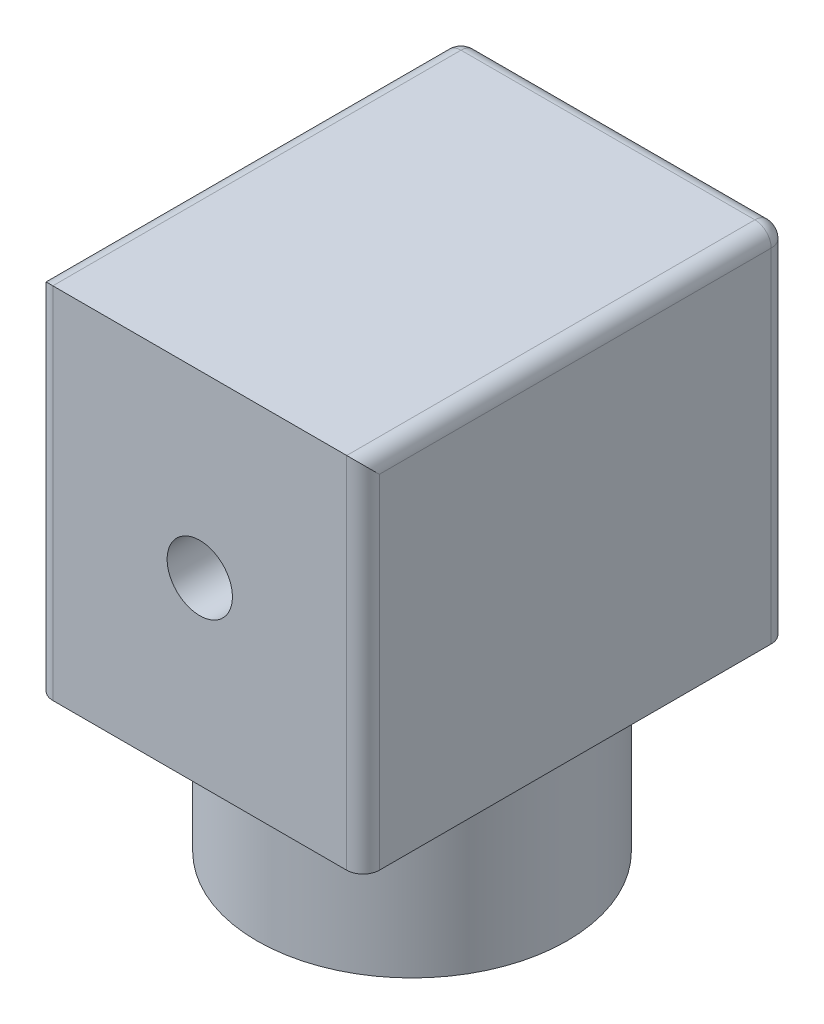
ISO-10303-21;
HEADER;
FILE_DESCRIPTION(('STEP AP214'),'2;1');
FILE_NAME('part.step','',(''),(''),'','','');
FILE_SCHEMA(('AUTOMOTIVE_DESIGN { 1 0 10303 214 1 1 1 1 }'));
ENDSEC;
DATA;
#1=APPLICATION_CONTEXT('core data for automotive mechanical design processes');
#2=APPLICATION_PROTOCOL_DEFINITION('international standard','automotive_design',2000,#1);
#3=PRODUCT_CONTEXT('',#1,'mechanical');
#4=PRODUCT('Part','Part','',(#3));
#5=PRODUCT_RELATED_PRODUCT_CATEGORY('part','',(#4));
#6=PRODUCT_DEFINITION_FORMATION('','',#4);
#7=PRODUCT_DEFINITION_CONTEXT('part definition',#1,'design');
#8=PRODUCT_DEFINITION('design','',#6,#7);
#9=PRODUCT_DEFINITION_SHAPE('','',#8);
#10=(LENGTH_UNIT() NAMED_UNIT(*) SI_UNIT(.MILLI.,.METRE.));
#11=(NAMED_UNIT(*) PLANE_ANGLE_UNIT() SI_UNIT($,.RADIAN.));
#12=(NAMED_UNIT(*) SI_UNIT($,.STERADIAN.) SOLID_ANGLE_UNIT());
#13=UNCERTAINTY_MEASURE_WITH_UNIT(LENGTH_MEASURE(1.E-05),#10,'distance_accuracy_value','');
#14=(GEOMETRIC_REPRESENTATION_CONTEXT(3) GLOBAL_UNCERTAINTY_ASSIGNED_CONTEXT((#13)) GLOBAL_UNIT_ASSIGNED_CONTEXT((#10,
#11,#12)) REPRESENTATION_CONTEXT('',''));
#15=CARTESIAN_POINT('',(0.,0.,0.));
#16=DIRECTION('',(0.,0.,1.));
#17=DIRECTION('',(1.,0.,0.));
#18=AXIS2_PLACEMENT_3D('',#15,#16,#17);
#19=CARTESIAN_POINT('',(-50.,55.,130.));
#20=DIRECTION('',(1.,0.,0.));
#21=DIRECTION('',(0.,1.,0.));
#22=AXIS2_PLACEMENT_3D('',#19,#20,#21);
#23=PLANE('',#22);
#24=DIRECTION('',(0.,0.,-1.));
#25=VECTOR('',#24,1.);
#26=CARTESIAN_POINT('',(-50.,-55.,130.));
#27=LINE('',#26,#25);
#28=CARTESIAN_POINT('',(-50.,-55.,125.));
#29=VERTEX_POINT('',#28);
#30=CARTESIAN_POINT('',(-50.,-55.,5.));
#31=VERTEX_POINT('',#30);
#32=EDGE_CURVE('E118',#29,#31,#27,.T.);
#33=ORIENTED_EDGE('',*,*,#32,.F.);
#34=DIRECTION('',(0.,-1.,0.));
#35=VECTOR('',#34,1.);
#36=CARTESIAN_POINT('',(-50.,55.,125.));
#37=LINE('',#36,#35);
#38=CARTESIAN_POINT('',(-50.,50.,125.));
#39=VERTEX_POINT('',#38);
#40=EDGE_CURVE('E131',#29,#39,#37,.F.);
#41=ORIENTED_EDGE('',*,*,#40,.T.);
#42=DIRECTION('',(0.,0.,-1.));
#43=VECTOR('',#42,1.);
#44=CARTESIAN_POINT('',(-50.,50.,130.));
#45=LINE('',#44,#43);
#46=CARTESIAN_POINT('',(-50.,50.,5.));
#47=VERTEX_POINT('',#46);
#48=EDGE_CURVE('E134',#39,#47,#45,.T.);
#49=ORIENTED_EDGE('',*,*,#48,.T.);
#50=DIRECTION('',(0.,-1.,0.));
#51=VECTOR('',#50,1.);
#52=CARTESIAN_POINT('',(-50.,-55.,5.));
#53=LINE('',#52,#51);
#54=EDGE_CURVE('E141',#47,#31,#53,.T.);
#55=ORIENTED_EDGE('',*,*,#54,.T.);
#56=EDGE_LOOP('',(#33,#41,#49,#55));
#57=FACE_BOUND('',#56,.T.);
#58=ADVANCED_FACE('F36',(#57),#23,.F.);
#59=CARTESIAN_POINT('',(50.,-55.,130.));
#60=DIRECTION('',(0.,1.,0.));
#61=DIRECTION('',(-1.,0.,0.));
#62=AXIS2_PLACEMENT_3D('',#59,#60,#61);
#63=PLANE('',#62);
#64=CARTESIAN_POINT('',(0.,-55.,65.));
#65=DIRECTION('',(0.,1.,0.));
#66=DIRECTION('',(-1.,0.,0.));
#67=AXIS2_PLACEMENT_3D('',#64,#65,#66);
#68=CIRCLE('',#67,47.5);
#69=CARTESIAN_POINT('',(-47.5,-55.,65.));
#70=VERTEX_POINT('',#69);
#71=EDGE_CURVE('E189',#70,#70,#68,.T.);
#72=ORIENTED_EDGE('',*,*,#71,.T.);
#73=EDGE_LOOP('',(#72));
#74=FACE_BOUND('',#73,.T.);
#75=DIRECTION('',(0.,0.,-1.));
#76=VECTOR('',#75,1.);
#77=CARTESIAN_POINT('',(50.,-55.,130.));
#78=LINE('',#77,#76);
#79=CARTESIAN_POINT('',(50.,-55.,125.));
#80=VERTEX_POINT('',#79);
#81=CARTESIAN_POINT('',(50.,-55.,5.));
#82=VERTEX_POINT('',#81);
#83=EDGE_CURVE('E198',#80,#82,#78,.T.);
#84=ORIENTED_EDGE('',*,*,#83,.F.);
#85=CARTESIAN_POINT('',(45.,-55.,125.));
#86=DIRECTION('',(0.,1.,0.));
#87=DIRECTION('',(-1.,0.,0.));
#88=AXIS2_PLACEMENT_3D('',#85,#86,#87);
#89=CIRCLE('',#88,5.);
#90=CARTESIAN_POINT('',(45.,-55.,130.));
#91=VERTEX_POINT('',#90);
#92=EDGE_CURVE('E127',#80,#91,#89,.F.);
#93=ORIENTED_EDGE('',*,*,#92,.T.);
#94=DIRECTION('',(1.,0.,0.));
#95=VECTOR('',#94,1.);
#96=CARTESIAN_POINT('',(50.,-55.,130.));
#97=LINE('',#96,#95);
#98=CARTESIAN_POINT('',(-45.,-55.,130.));
#99=VERTEX_POINT('',#98);
#100=EDGE_CURVE('E110',#99,#91,#97,.T.);
#101=ORIENTED_EDGE('',*,*,#100,.F.);
#102=CARTESIAN_POINT('',(-45.,-55.,125.));
#103=DIRECTION('',(0.,1.,0.));
#104=DIRECTION('',(-1.,0.,0.));
#105=AXIS2_PLACEMENT_3D('',#102,#103,#104);
#106=CIRCLE('',#105,5.);
#107=EDGE_CURVE('E124',#99,#29,#106,.F.);
#108=ORIENTED_EDGE('',*,*,#107,.T.);
#109=ORIENTED_EDGE('',*,*,#32,.T.);
#110=CARTESIAN_POINT('',(-45.,-55.,5.));
#111=DIRECTION('',(0.,1.,0.));
#112=DIRECTION('',(-1.,0.,0.));
#113=AXIS2_PLACEMENT_3D('',#110,#111,#112);
#114=CIRCLE('',#113,5.);
#115=CARTESIAN_POINT('',(-45.,-55.,0.));
#116=VERTEX_POINT('',#115);
#117=EDGE_CURVE('E136',#31,#116,#114,.F.);
#118=ORIENTED_EDGE('',*,*,#117,.T.);
#119=DIRECTION('',(1.,0.,0.));
#120=VECTOR('',#119,1.);
#121=CARTESIAN_POINT('',(50.,-55.,0.));
#122=LINE('',#121,#120);
#123=CARTESIAN_POINT('',(45.,-55.,0.));
#124=VERTEX_POINT('',#123);
#125=EDGE_CURVE('E128',#116,#124,#122,.T.);
#126=ORIENTED_EDGE('',*,*,#125,.T.);
#127=CARTESIAN_POINT('',(45.,-55.,5.));
#128=DIRECTION('',(0.,1.,0.));
#129=DIRECTION('',(-1.,0.,0.));
#130=AXIS2_PLACEMENT_3D('',#127,#128,#129);
#131=CIRCLE('',#130,5.);
#132=EDGE_CURVE('E132',#124,#82,#131,.F.);
#133=ORIENTED_EDGE('',*,*,#132,.T.);
#134=EDGE_LOOP('',(#84,#93,#101,#108,#109,#118,#126,#133));
#135=FACE_BOUND('',#134,.T.);
#136=ADVANCED_FACE('F122',(#74,#135),#63,.F.);
#137=CARTESIAN_POINT('',(50.,55.,130.));
#138=DIRECTION('',(-1.,0.,0.));
#139=DIRECTION('',(0.,-1.,0.));
#140=AXIS2_PLACEMENT_3D('',#137,#138,#139);
#141=PLANE('',#140);
#142=DIRECTION('',(0.,0.,-1.));
#143=VECTOR('',#142,1.);
#144=CARTESIAN_POINT('',(50.,50.,130.));
#145=LINE('',#144,#143);
#146=CARTESIAN_POINT('',(50.,50.,5.));
#147=VERTEX_POINT('',#146);
#148=CARTESIAN_POINT('',(50.,50.,125.));
#149=VERTEX_POINT('',#148);
#150=EDGE_CURVE('E205',#147,#149,#145,.F.);
#151=ORIENTED_EDGE('',*,*,#150,.T.);
#152=DIRECTION('',(0.,1.,0.));
#153=VECTOR('',#152,1.);
#154=CARTESIAN_POINT('',(50.,55.,125.));
#155=LINE('',#154,#153);
#156=EDGE_CURVE('E209',#149,#80,#155,.F.);
#157=ORIENTED_EDGE('',*,*,#156,.T.);
#158=ORIENTED_EDGE('',*,*,#83,.T.);
#159=DIRECTION('',(0.,1.,0.));
#160=VECTOR('',#159,1.);
#161=CARTESIAN_POINT('',(50.,55.,5.));
#162=LINE('',#161,#160);
#163=EDGE_CURVE('E207',#82,#147,#162,.T.);
#164=ORIENTED_EDGE('',*,*,#163,.T.);
#165=EDGE_LOOP('',(#151,#157,#158,#164));
#166=FACE_BOUND('',#165,.T.);
#167=ADVANCED_FACE('F232',(#166),#141,.F.);
#168=CARTESIAN_POINT('',(50.,55.,130.));
#169=DIRECTION('',(0.,-1.,0.));
#170=DIRECTION('',(1.,0.,0.));
#171=AXIS2_PLACEMENT_3D('',#168,#169,#170);
#172=PLANE('',#171);
#173=DIRECTION('',(-1.,0.,0.));
#174=VECTOR('',#173,1.);
#175=CARTESIAN_POINT('',(50.,55.,130.));
#176=LINE('',#175,#174);
#177=CARTESIAN_POINT('',(45.,55.,130.));
#178=VERTEX_POINT('',#177);
#179=CARTESIAN_POINT('',(-45.,55.,130.));
#180=VERTEX_POINT('',#179);
#181=EDGE_CURVE('E112',#178,#180,#176,.T.);
#182=ORIENTED_EDGE('',*,*,#181,.F.);
#183=DIRECTION('',(0.,0.,-1.));
#184=VECTOR('',#183,1.);
#185=CARTESIAN_POINT('',(45.,55.,130.));
#186=LINE('',#185,#184);
#187=CARTESIAN_POINT('',(45.,55.,5.));
#188=VERTEX_POINT('',#187);
#189=EDGE_CURVE('E11',#178,#188,#186,.T.);
#190=ORIENTED_EDGE('',*,*,#189,.T.);
#191=DIRECTION('',(-1.,0.,0.));
#192=VECTOR('',#191,1.);
#193=CARTESIAN_POINT('',(-50.,55.,5.));
#194=LINE('',#193,#192);
#195=CARTESIAN_POINT('',(-45.,55.,5.));
#196=VERTEX_POINT('',#195);
#197=EDGE_CURVE('E45',#188,#196,#194,.T.);
#198=ORIENTED_EDGE('',*,*,#197,.T.);
#199=DIRECTION('',(0.,0.,-1.));
#200=VECTOR('',#199,1.);
#201=CARTESIAN_POINT('',(-45.,55.,130.));
#202=LINE('',#201,#200);
#203=EDGE_CURVE('E150',#196,#180,#202,.F.);
#204=ORIENTED_EDGE('',*,*,#203,.T.);
#205=EDGE_LOOP('',(#182,#190,#198,#204));
#206=FACE_BOUND('',#205,.T.);
#207=ADVANCED_FACE('F240',(#206),#172,.F.);
#208=CARTESIAN_POINT('',(0.,0.,130.));
#209=DIRECTION('',(0.,0.,-1.));
#210=DIRECTION('',(-1.,0.,0.));
#211=AXIS2_PLACEMENT_3D('',#208,#209,#210);
#212=PLANE('',#211);
#213=CARTESIAN_POINT('',(0.,0.,130.));
#214=DIRECTION('',(0.,0.,1.));
#215=DIRECTION('',(1.,0.,0.));
#216=AXIS2_PLACEMENT_3D('',#213,#214,#215);
#217=CIRCLE('',#216,10.);
#218=CARTESIAN_POINT('',(10.,0.,130.));
#219=VERTEX_POINT('',#218);
#220=EDGE_CURVE('E174',#219,#219,#217,.T.);
#221=ORIENTED_EDGE('',*,*,#220,.F.);
#222=EDGE_LOOP('',(#221));
#223=FACE_BOUND('',#222,.T.);
#224=ORIENTED_EDGE('',*,*,#100,.T.);
#225=DIRECTION('',(0.,1.,0.));
#226=VECTOR('',#225,1.);
#227=CARTESIAN_POINT('',(45.,0.,130.));
#228=LINE('',#227,#226);
#229=EDGE_CURVE('E117',#91,#178,#228,.T.);
#230=ORIENTED_EDGE('',*,*,#229,.T.);
#231=ORIENTED_EDGE('',*,*,#181,.T.);
#232=DIRECTION('',(0.,-1.,0.));
#233=VECTOR('',#232,1.);
#234=CARTESIAN_POINT('',(-45.,0.,130.));
#235=LINE('',#234,#233);
#236=EDGE_CURVE('E106',#180,#99,#235,.T.);
#237=ORIENTED_EDGE('',*,*,#236,.T.);
#238=EDGE_LOOP('',(#224,#230,#231,#237));
#239=FACE_BOUND('',#238,.T.);
#240=ADVANCED_FACE('F108',(#223,#239),#212,.F.);
#241=CARTESIAN_POINT('',(0.,0.,0.));
#242=DIRECTION('',(0.,0.,-1.));
#243=DIRECTION('',(-1.,0.,0.));
#244=AXIS2_PLACEMENT_3D('',#241,#242,#243);
#245=PLANE('',#244);
#246=DIRECTION('',(-1.,0.,0.));
#247=VECTOR('',#246,1.);
#248=CARTESIAN_POINT('',(50.,50.,0.));
#249=LINE('',#248,#247);
#250=CARTESIAN_POINT('',(-45.,50.,0.));
#251=VERTEX_POINT('',#250);
#252=CARTESIAN_POINT('',(45.,50.,0.));
#253=VERTEX_POINT('',#252);
#254=EDGE_CURVE('E144',#251,#253,#249,.F.);
#255=ORIENTED_EDGE('',*,*,#254,.T.);
#256=DIRECTION('',(0.,1.,0.));
#257=VECTOR('',#256,1.);
#258=CARTESIAN_POINT('',(45.,-55.,0.));
#259=LINE('',#258,#257);
#260=EDGE_CURVE('E148',#253,#124,#259,.F.);
#261=ORIENTED_EDGE('',*,*,#260,.T.);
#262=ORIENTED_EDGE('',*,*,#125,.F.);
#263=DIRECTION('',(0.,-1.,0.));
#264=VECTOR('',#263,1.);
#265=CARTESIAN_POINT('',(-45.,55.,0.));
#266=LINE('',#265,#264);
#267=EDGE_CURVE('E146',#116,#251,#266,.F.);
#268=ORIENTED_EDGE('',*,*,#267,.T.);
#269=EDGE_LOOP('',(#255,#261,#262,#268));
#270=FACE_BOUND('',#269,.T.);
#271=ADVANCED_FACE('F217',(#270),#245,.T.);
#272=CARTESIAN_POINT('',(0.,-105.,65.));
#273=DIRECTION('',(0.,1.,0.));
#274=DIRECTION('',(-1.,0.,0.));
#275=AXIS2_PLACEMENT_3D('',#272,#273,#274);
#276=CYLINDRICAL_SURFACE('',#275,47.5);
#277=CARTESIAN_POINT('',(0.,-105.,65.));
#278=DIRECTION('',(0.,1.,0.));
#279=DIRECTION('',(-1.,0.,0.));
#280=AXIS2_PLACEMENT_3D('',#277,#278,#279);
#281=CIRCLE('',#280,47.5);
#282=CARTESIAN_POINT('',(-47.5,-105.,65.));
#283=VERTEX_POINT('',#282);
#284=EDGE_CURVE('E192',#283,#283,#281,.T.);
#285=ORIENTED_EDGE('',*,*,#284,.T.);
#286=EDGE_LOOP('',(#285));
#287=FACE_BOUND('',#286,.T.);
#288=ORIENTED_EDGE('',*,*,#71,.F.);
#289=EDGE_LOOP('',(#288));
#290=FACE_BOUND('',#289,.T.);
#291=ADVANCED_FACE('F295',(#287,#290),#276,.T.);
#292=CARTESIAN_POINT('',(0.,-105.,65.));
#293=DIRECTION('',(0.,1.,0.));
#294=DIRECTION('',(-1.,0.,0.));
#295=AXIS2_PLACEMENT_3D('',#292,#293,#294);
#296=PLANE('',#295);
#297=CARTESIAN_POINT('',(0.,-105.,65.));
#298=DIRECTION('',(0.,-1.,0.));
#299=DIRECTION('',(0.,0.,-1.));
#300=AXIS2_PLACEMENT_3D('',#297,#298,#299);
#301=CIRCLE('',#300,10.);
#302=CARTESIAN_POINT('',(0.,-105.,55.));
#303=VERTEX_POINT('',#302);
#304=EDGE_CURVE('E183',#303,#303,#301,.T.);
#305=ORIENTED_EDGE('',*,*,#304,.F.);
#306=EDGE_LOOP('',(#305));
#307=FACE_BOUND('',#306,.T.);
#308=ORIENTED_EDGE('',*,*,#284,.F.);
#309=EDGE_LOOP('',(#308));
#310=FACE_BOUND('',#309,.T.);
#311=ADVANCED_FACE('F291',(#307,#310),#296,.F.);
#312=CARTESIAN_POINT('',(0.,-85.,65.));
#313=DIRECTION('',(0.,-1.,0.));
#314=DIRECTION('',(0.,0.,-1.));
#315=AXIS2_PLACEMENT_3D('',#312,#313,#314);
#316=CYLINDRICAL_SURFACE('',#315,10.);
#317=CARTESIAN_POINT('',(0.,-85.,65.));
#318=DIRECTION('',(0.,-1.,0.));
#319=DIRECTION('',(0.,0.,-1.));
#320=AXIS2_PLACEMENT_3D('',#317,#318,#319);
#321=CIRCLE('',#320,10.);
#322=CARTESIAN_POINT('',(0.,-85.,55.));
#323=VERTEX_POINT('',#322);
#324=EDGE_CURVE('E186',#323,#323,#321,.T.);
#325=ORIENTED_EDGE('',*,*,#324,.F.);
#326=EDGE_LOOP('',(#325));
#327=FACE_BOUND('',#326,.T.);
#328=ORIENTED_EDGE('',*,*,#304,.T.);
#329=EDGE_LOOP('',(#328));
#330=FACE_BOUND('',#329,.T.);
#331=ADVANCED_FACE('F287',(#327,#330),#316,.F.);
#332=CARTESIAN_POINT('',(0.,-85.,65.));
#333=DIRECTION('',(0.,-1.,0.));
#334=DIRECTION('',(0.,0.,-1.));
#335=AXIS2_PLACEMENT_3D('',#332,#333,#334);
#336=PLANE('',#335);
#337=ORIENTED_EDGE('',*,*,#324,.T.);
#338=EDGE_LOOP('',(#337));
#339=FACE_BOUND('',#338,.T.);
#340=ADVANCED_FACE('F281',(#339),#336,.T.);
#341=CARTESIAN_POINT('',(0.,0.,110.));
#342=DIRECTION('',(0.,0.,1.));
#343=DIRECTION('',(1.,0.,0.));
#344=AXIS2_PLACEMENT_3D('',#341,#342,#343);
#345=CYLINDRICAL_SURFACE('',#344,10.);
#346=CARTESIAN_POINT('',(0.,0.,110.));
#347=DIRECTION('',(0.,0.,1.));
#348=DIRECTION('',(1.,0.,0.));
#349=AXIS2_PLACEMENT_3D('',#346,#347,#348);
#350=CIRCLE('',#349,10.);
#351=CARTESIAN_POINT('',(10.,0.,110.));
#352=VERTEX_POINT('',#351);
#353=EDGE_CURVE('E178',#352,#352,#350,.T.);
#354=ORIENTED_EDGE('',*,*,#353,.F.);
#355=EDGE_LOOP('',(#354));
#356=FACE_BOUND('',#355,.T.);
#357=ORIENTED_EDGE('',*,*,#220,.T.);
#358=EDGE_LOOP('',(#357));
#359=FACE_BOUND('',#358,.T.);
#360=ADVANCED_FACE('F275',(#356,#359),#345,.F.);
#361=CARTESIAN_POINT('',(0.,0.,110.));
#362=DIRECTION('',(0.,0.,1.));
#363=DIRECTION('',(1.,0.,0.));
#364=AXIS2_PLACEMENT_3D('',#361,#362,#363);
#365=PLANE('',#364);
#366=ORIENTED_EDGE('',*,*,#353,.T.);
#367=EDGE_LOOP('',(#366));
#368=FACE_BOUND('',#367,.T.);
#369=ADVANCED_FACE('F271',(#368),#365,.T.);
#370=CARTESIAN_POINT('',(-45.,0.,125.));
#371=DIRECTION('',(0.,-1.,0.));
#372=DIRECTION('',(1.,0.,0.));
#373=AXIS2_PLACEMENT_3D('',#370,#371,#372);
#374=CYLINDRICAL_SURFACE('',#373,5.);
#375=ORIENTED_EDGE('',*,*,#107,.F.);
#376=ORIENTED_EDGE('',*,*,#236,.F.);
#377=CARTESIAN_POINT('',(-45.,50.,125.));
#378=DIRECTION('',(0.,0.707106781186547,-0.707106781186547));
#379=DIRECTION('',(0.,-0.707106781186547,-0.707106781186547));
#380=AXIS2_PLACEMENT_3D('',#377,#378,#379);
#381=ELLIPSE('',#380,7.07106781186547,5.);
#382=EDGE_CURVE('E40',#39,#180,#381,.T.);
#383=ORIENTED_EDGE('',*,*,#382,.F.);
#384=ORIENTED_EDGE('',*,*,#40,.F.);
#385=EDGE_LOOP('',(#375,#376,#383,#384));
#386=FACE_BOUND('',#385,.T.);
#387=ADVANCED_FACE('F38',(#386),#374,.T.);
#388=CARTESIAN_POINT('',(-45.,50.,130.));
#389=DIRECTION('',(0.,0.,-1.));
#390=DIRECTION('',(-1.,0.,0.));
#391=AXIS2_PLACEMENT_3D('',#388,#389,#390);
#392=CYLINDRICAL_SURFACE('',#391,5.);
#393=ORIENTED_EDGE('',*,*,#382,.T.);
#394=ORIENTED_EDGE('',*,*,#203,.F.);
#395=CARTESIAN_POINT('',(-45.,50.,5.));
#396=DIRECTION('',(0.,0.,-1.));
#397=DIRECTION('',(-1.,0.,0.));
#398=AXIS2_PLACEMENT_3D('',#395,#396,#397);
#399=CIRCLE('',#398,5.);
#400=EDGE_CURVE('E169',#47,#196,#399,.T.);
#401=ORIENTED_EDGE('',*,*,#400,.F.);
#402=ORIENTED_EDGE('',*,*,#48,.F.);
#403=EDGE_LOOP('',(#393,#394,#401,#402));
#404=FACE_BOUND('',#403,.T.);
#405=ADVANCED_FACE('F241',(#404),#392,.T.);
#406=CARTESIAN_POINT('',(-45.,55.,5.));
#407=DIRECTION('',(0.,1.,0.));
#408=DIRECTION('',(-1.,0.,0.));
#409=AXIS2_PLACEMENT_3D('',#406,#407,#408);
#410=CYLINDRICAL_SURFACE('',#409,5.);
#411=ORIENTED_EDGE('',*,*,#117,.F.);
#412=ORIENTED_EDGE('',*,*,#54,.F.);
#413=CARTESIAN_POINT('',(-45.,50.,5.));
#414=DIRECTION('',(0.,1.,0.));
#415=DIRECTION('',(0.,0.,1.));
#416=AXIS2_PLACEMENT_3D('',#413,#414,#415);
#417=CIRCLE('',#416,5.);
#418=EDGE_CURVE('E167',#251,#47,#417,.T.);
#419=ORIENTED_EDGE('',*,*,#418,.F.);
#420=ORIENTED_EDGE('',*,*,#267,.F.);
#421=EDGE_LOOP('',(#411,#412,#419,#420));
#422=FACE_BOUND('',#421,.T.);
#423=ADVANCED_FACE('F220',(#422),#410,.T.);
#424=CARTESIAN_POINT('',(-45.,50.,5.));
#425=DIRECTION('',(0.,0.,1.));
#426=DIRECTION('',(1.,0.,0.));
#427=AXIS2_PLACEMENT_3D('',#424,#425,#426);
#428=SPHERICAL_SURFACE('',#427,5.);
#429=ORIENTED_EDGE('',*,*,#418,.T.);
#430=ORIENTED_EDGE('',*,*,#400,.T.);
#431=CARTESIAN_POINT('',(-45.,50.,5.));
#432=DIRECTION('',(-1.,0.,0.));
#433=DIRECTION('',(0.,0.,1.));
#434=AXIS2_PLACEMENT_3D('',#431,#432,#433);
#435=CIRCLE('',#434,5.);
#436=EDGE_CURVE('E164',#251,#196,#435,.F.);
#437=ORIENTED_EDGE('',*,*,#436,.F.);
#438=EDGE_LOOP('',(#429,#430,#437));
#439=FACE_BOUND('',#438,.T.);
#440=ADVANCED_FACE('F222',(#439),#428,.T.);
#441=CARTESIAN_POINT('',(50.,50.,5.));
#442=DIRECTION('',(1.,0.,0.));
#443=DIRECTION('',(0.,1.,0.));
#444=AXIS2_PLACEMENT_3D('',#441,#442,#443);
#445=CYLINDRICAL_SURFACE('',#444,5.);
#446=ORIENTED_EDGE('',*,*,#436,.T.);
#447=ORIENTED_EDGE('',*,*,#197,.F.);
#448=CARTESIAN_POINT('',(45.,50.,5.));
#449=DIRECTION('',(1.,0.,0.));
#450=DIRECTION('',(0.,0.,-1.));
#451=AXIS2_PLACEMENT_3D('',#448,#449,#450);
#452=CIRCLE('',#451,5.);
#453=EDGE_CURVE('E161',#253,#188,#452,.T.);
#454=ORIENTED_EDGE('',*,*,#453,.F.);
#455=ORIENTED_EDGE('',*,*,#254,.F.);
#456=EDGE_LOOP('',(#446,#447,#454,#455));
#457=FACE_BOUND('',#456,.T.);
#458=ADVANCED_FACE('F225',(#457),#445,.T.);
#459=CARTESIAN_POINT('',(45.,55.,5.));
#460=DIRECTION('',(0.,-1.,0.));
#461=DIRECTION('',(1.,0.,0.));
#462=AXIS2_PLACEMENT_3D('',#459,#460,#461);
#463=CYLINDRICAL_SURFACE('',#462,5.);
#464=ORIENTED_EDGE('',*,*,#132,.F.);
#465=ORIENTED_EDGE('',*,*,#260,.F.);
#466=CARTESIAN_POINT('',(45.,50.,5.));
#467=DIRECTION('',(0.,1.,0.));
#468=DIRECTION('',(0.,0.,1.));
#469=AXIS2_PLACEMENT_3D('',#466,#467,#468);
#470=CIRCLE('',#469,5.);
#471=EDGE_CURVE('E158',#147,#253,#470,.T.);
#472=ORIENTED_EDGE('',*,*,#471,.F.);
#473=ORIENTED_EDGE('',*,*,#163,.F.);
#474=EDGE_LOOP('',(#464,#465,#472,#473));
#475=FACE_BOUND('',#474,.T.);
#476=ADVANCED_FACE('F228',(#475),#463,.T.);
#477=CARTESIAN_POINT('',(45.,50.,5.));
#478=DIRECTION('',(0.,0.,1.));
#479=DIRECTION('',(1.,0.,0.));
#480=AXIS2_PLACEMENT_3D('',#477,#478,#479);
#481=SPHERICAL_SURFACE('',#480,5.);
#482=ORIENTED_EDGE('',*,*,#471,.T.);
#483=ORIENTED_EDGE('',*,*,#453,.T.);
#484=CARTESIAN_POINT('',(45.,50.,5.));
#485=DIRECTION('',(0.,0.,-1.));
#486=DIRECTION('',(-1.,0.,0.));
#487=AXIS2_PLACEMENT_3D('',#484,#485,#486);
#488=CIRCLE('',#487,5.);
#489=EDGE_CURVE('E155',#147,#188,#488,.F.);
#490=ORIENTED_EDGE('',*,*,#489,.F.);
#491=EDGE_LOOP('',(#482,#483,#490));
#492=FACE_BOUND('',#491,.T.);
#493=ADVANCED_FACE('F256',(#492),#481,.T.);
#494=CARTESIAN_POINT('',(45.,50.,130.));
#495=DIRECTION('',(0.,0.,-1.));
#496=DIRECTION('',(-1.,0.,0.));
#497=AXIS2_PLACEMENT_3D('',#494,#495,#496);
#498=CYLINDRICAL_SURFACE('',#497,5.);
#499=ORIENTED_EDGE('',*,*,#489,.T.);
#500=ORIENTED_EDGE('',*,*,#189,.F.);
#501=CARTESIAN_POINT('',(45.,50.,125.));
#502=DIRECTION('',(0.,0.707106781186547,-0.707106781186547));
#503=DIRECTION('',(0.,-0.707106781186547,-0.707106781186547));
#504=AXIS2_PLACEMENT_3D('',#501,#502,#503);
#505=ELLIPSE('',#504,7.07106781186547,5.);
#506=EDGE_CURVE('E153',#149,#178,#505,.F.);
#507=ORIENTED_EDGE('',*,*,#506,.F.);
#508=ORIENTED_EDGE('',*,*,#150,.F.);
#509=EDGE_LOOP('',(#499,#500,#507,#508));
#510=FACE_BOUND('',#509,.T.);
#511=ADVANCED_FACE('F239',(#510),#498,.T.);
#512=CARTESIAN_POINT('',(45.,0.,125.));
#513=DIRECTION('',(0.,1.,0.));
#514=DIRECTION('',(-1.,0.,0.));
#515=AXIS2_PLACEMENT_3D('',#512,#513,#514);
#516=CYLINDRICAL_SURFACE('',#515,5.);
#517=ORIENTED_EDGE('',*,*,#92,.F.);
#518=ORIENTED_EDGE('',*,*,#156,.F.);
#519=ORIENTED_EDGE('',*,*,#506,.T.);
#520=ORIENTED_EDGE('',*,*,#229,.F.);
#521=EDGE_LOOP('',(#517,#518,#519,#520));
#522=FACE_BOUND('',#521,.T.);
#523=ADVANCED_FACE('F237',(#522),#516,.T.);
#524=CLOSED_SHELL('',(#58,#136,#167,#207,#240,#271,#291,#311,#331,#340,#360,#369,#387,#405,#423,
#440,#458,#476,#493,#511,#523));
#525=MANIFOLD_SOLID_BREP('B2',#524);
#526=ADVANCED_BREP_SHAPE_REPRESENTATION('',(#18,#525),#14);
#527=SHAPE_DEFINITION_REPRESENTATION(#9,#526);
ENDSEC;
END-ISO-10303-21;
